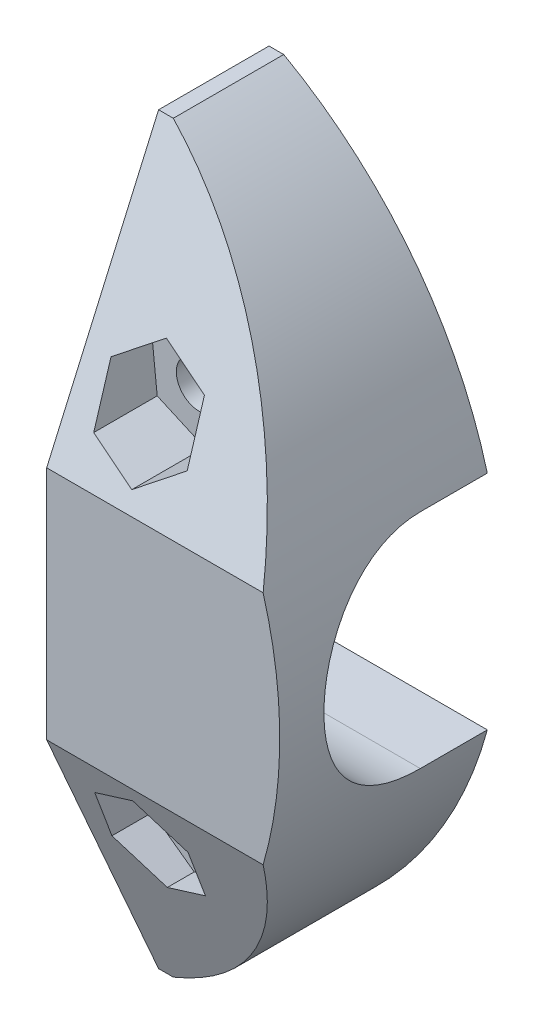
ISO-10303-21;
HEADER;
FILE_DESCRIPTION(('STEP AP214'),'2;1');
FILE_NAME('part.step','',(''),(''),'','','');
FILE_SCHEMA(('AUTOMOTIVE_DESIGN { 1 0 10303 214 1 1 1 1 }'));
ENDSEC;
DATA;
#1=APPLICATION_CONTEXT('core data for automotive mechanical design processes');
#2=APPLICATION_PROTOCOL_DEFINITION('international standard','automotive_design',2000,#1);
#3=PRODUCT_CONTEXT('',#1,'mechanical');
#4=PRODUCT('Part','Part','',(#3));
#5=PRODUCT_RELATED_PRODUCT_CATEGORY('part','',(#4));
#6=PRODUCT_DEFINITION_FORMATION('','',#4);
#7=PRODUCT_DEFINITION_CONTEXT('part definition',#1,'design');
#8=PRODUCT_DEFINITION('design','',#6,#7);
#9=PRODUCT_DEFINITION_SHAPE('','',#8);
#10=(LENGTH_UNIT() NAMED_UNIT(*) SI_UNIT(.MILLI.,.METRE.));
#11=(NAMED_UNIT(*) PLANE_ANGLE_UNIT() SI_UNIT($,.RADIAN.));
#12=(NAMED_UNIT(*) SI_UNIT($,.STERADIAN.) SOLID_ANGLE_UNIT());
#13=UNCERTAINTY_MEASURE_WITH_UNIT(LENGTH_MEASURE(1.E-05),#10,'distance_accuracy_value','');
#14=(GEOMETRIC_REPRESENTATION_CONTEXT(3) GLOBAL_UNCERTAINTY_ASSIGNED_CONTEXT((#13)) GLOBAL_UNIT_ASSIGNED_CONTEXT((#10,
#11,#12)) REPRESENTATION_CONTEXT('',''));
#15=CARTESIAN_POINT('',(0.,0.,0.));
#16=DIRECTION('',(0.,0.,1.));
#17=DIRECTION('',(1.,0.,0.));
#18=AXIS2_PLACEMENT_3D('',#15,#16,#17);
#19=CARTESIAN_POINT('',(598.976291153302,1616.33019387491,121.824310043391));
#20=DIRECTION('',(0.,0.,1.));
#21=DIRECTION('',(1.,0.,0.));
#22=AXIS2_PLACEMENT_3D('',#19,#20,#21);
#23=PLANE('',#22);
#24=CARTESIAN_POINT('',(602.193649020213,1619.83273752735,121.824310043391));
#25=DIRECTION('',(0.,0.,1.));
#26=DIRECTION('',(1.,0.,0.));
#27=AXIS2_PLACEMENT_3D('',#24,#25,#26);
#28=CIRCLE('',#27,1.54999999999994);
#29=CARTESIAN_POINT('',(603.743649020213,1619.83273752735,121.824310043391));
#30=VERTEX_POINT('',#29);
#31=EDGE_CURVE('E20',#30,#30,#28,.T.);
#32=ORIENTED_EDGE('',*,*,#31,.F.);
#33=EDGE_LOOP('',(#32));
#34=FACE_BOUND('',#33,.T.);
#35=DIRECTION('',(-0.809016994374525,-0.587785252293055,0.));
#36=VECTOR('',#35,1.);
#37=CARTESIAN_POINT('',(603.986394039705,1617.3652356945,121.824310043391));
#38=LINE('',#37,#36);
#39=CARTESIAN_POINT('',(605.411006887008,1618.40027751402,121.824310043391));
#40=VERTEX_POINT('',#39);
#41=CARTESIAN_POINT('',(602.561781192153,1616.33019387497,121.824310043391));
#42=VERTEX_POINT('',#41);
#43=EDGE_CURVE('E173',#40,#42,#38,.T.);
#44=ORIENTED_EDGE('',*,*,#43,.F.);
#45=DIRECTION('',(0.104528463267525,-0.994521895368287,0.));
#46=VECTOR('',#45,1.);
#47=CARTESIAN_POINT('',(605.226940801088,1620.15154934032,121.824310043391));
#48=LINE('',#47,#46);
#49=CARTESIAN_POINT('',(605.042874714788,1621.90282116665,121.824310043391));
#50=VERTEX_POINT('',#49);
#51=EDGE_CURVE('E170',#50,#40,#48,.T.);
#52=ORIENTED_EDGE('',*,*,#51,.F.);
#53=DIRECTION('',(0.913545457642818,-0.406736643075313,0.));
#54=VECTOR('',#53,1.);
#55=CARTESIAN_POINT('',(603.434195781596,1622.61905117316,121.824310043391));
#56=LINE('',#55,#54);
#57=CARTESIAN_POINT('',(601.825516848273,1623.33528117972,121.824310043391));
#58=VERTEX_POINT('',#57);
#59=EDGE_CURVE('E378',#58,#50,#56,.T.);
#60=ORIENTED_EDGE('',*,*,#59,.F.);
#61=DIRECTION('',(0.809016994375806,0.587785252291291,0.));
#62=VECTOR('',#61,1.);
#63=CARTESIAN_POINT('',(600.400904000721,1622.30023936019,121.824310043391));
#64=LINE('',#63,#62);
#65=CARTESIAN_POINT('',(598.976291153419,1621.26519754068,121.824310043391));
#66=VERTEX_POINT('',#65);
#67=EDGE_CURVE('E383',#66,#58,#64,.T.);
#68=ORIENTED_EDGE('',*,*,#67,.F.);
#69=DIRECTION('',(-0.104528463267267,0.994521895368314,0.));
#70=VECTOR('',#69,1.);
#71=CARTESIAN_POINT('',(599.160357239339,1619.51392571438,121.824310043391));
#72=LINE('',#71,#70);
#73=CARTESIAN_POINT('',(599.34442332536,1617.7626538883,121.824310043391));
#74=VERTEX_POINT('',#73);
#75=EDGE_CURVE('E386',#74,#66,#72,.T.);
#76=ORIENTED_EDGE('',*,*,#75,.F.);
#77=DIRECTION('',(-0.913545457642719,0.406736643075536,0.));
#78=VECTOR('',#77,1.);
#79=CARTESIAN_POINT('',(600.95310225883,1617.04642388154,121.824310043391));
#80=LINE('',#79,#78);
#81=EDGE_CURVE('E389',#42,#74,#80,.T.);
#82=ORIENTED_EDGE('',*,*,#81,.F.);
#83=EDGE_LOOP('',(#44,#52,#60,#68,#76,#82));
#84=FACE_BOUND('',#83,.T.);
#85=ADVANCED_FACE('F16',(#34,#84),#23,.T.);
#86=CARTESIAN_POINT('',(605.042874715052,1621.90282116653,121.824310043391));
#87=DIRECTION('',(-0.994521895368287,-0.104528463267525,0.));
#88=DIRECTION('',(0.104528463267525,-0.994521895368287,0.));
#89=AXIS2_PLACEMENT_3D('',#86,#87,#88);
#90=PLANE('',#89);
#91=ORIENTED_EDGE('',*,*,#51,.T.);
#92=DIRECTION('',(0.,0.,-1.));
#93=VECTOR('',#92,1.);
#94=CARTESIAN_POINT('',(605.411006887125,1618.4002775141,124.295449963961));
#95=LINE('',#94,#93);
#96=CARTESIAN_POINT('',(605.411006887125,1618.4002775141,125.85506712193));
#97=VERTEX_POINT('',#96);
#98=EDGE_CURVE('E167',#97,#40,#95,.T.);
#99=ORIENTED_EDGE('',*,*,#98,.F.);
#100=DIRECTION('',(0.0957497735269688,-0.910998241746222,0.401141102861359));
#101=VECTOR('',#100,1.);
#102=CARTESIAN_POINT('',(605.042874715052,1621.90282116653,124.312787280793));
#103=LINE('',#102,#101);
#104=CARTESIAN_POINT('',(605.042874715052,1621.90282116653,124.312787280793));
#105=VERTEX_POINT('',#104);
#106=EDGE_CURVE('E164',#105,#97,#103,.T.);
#107=ORIENTED_EDGE('',*,*,#106,.F.);
#108=DIRECTION('',(0.,0.,1.));
#109=VECTOR('',#108,1.);
#110=CARTESIAN_POINT('',(605.042874715052,1621.90282116653,123.068548662092));
#111=LINE('',#110,#109);
#112=EDGE_CURVE('E381',#50,#105,#111,.T.);
#113=ORIENTED_EDGE('',*,*,#112,.F.);
#114=EDGE_LOOP('',(#91,#99,#107,#113));
#115=FACE_BOUND('',#114,.T.);
#116=ADVANCED_FACE('F169',(#115),#90,.T.);
#117=CARTESIAN_POINT('',(605.411006887125,1618.4002775141,121.824310043391));
#118=DIRECTION('',(-0.587785252293055,0.809016994374525,0.));
#119=DIRECTION('',(-0.809016994374525,-0.587785252293054,0.));
#120=AXIS2_PLACEMENT_3D('',#117,#118,#119);
#121=PLANE('',#120);
#122=ORIENTED_EDGE('',*,*,#43,.T.);
#123=DIRECTION('',(0.,0.,-1.));
#124=VECTOR('',#123,1.);
#125=CARTESIAN_POINT('',(602.561781192285,1616.33019387491,124.295449963961));
#126=LINE('',#125,#124);
#127=CARTESIAN_POINT('',(602.561781192285,1616.33019387491,126.766589884529));
#128=VERTEX_POINT('',#127);
#129=EDGE_CURVE('E179',#128,#42,#126,.T.);
#130=ORIENTED_EDGE('',*,*,#129,.F.);
#131=DIRECTION('',(-0.783209396566297,-0.56903493493963,0.250563931858733));
#132=VECTOR('',#131,1.);
#133=CARTESIAN_POINT('',(605.411006887125,1618.4002775141,125.85506712193));
#134=LINE('',#133,#132);
#135=EDGE_CURVE('E176',#97,#128,#134,.T.);
#136=ORIENTED_EDGE('',*,*,#135,.F.);
#137=ORIENTED_EDGE('',*,*,#98,.T.);
#138=EDGE_LOOP('',(#122,#130,#136,#137));
#139=FACE_BOUND('',#138,.T.);
#140=ADVANCED_FACE('F177',(#139),#121,.T.);
#141=CARTESIAN_POINT('',(602.561781192285,1616.33019387491,121.824310043391));
#142=DIRECTION('',(0.406736643075536,0.913545457642719,0.));
#143=DIRECTION('',(-0.913545457642719,0.406736643075536,0.));
#144=AXIS2_PLACEMENT_3D('',#141,#142,#143);
#145=PLANE('',#144);
#146=ORIENTED_EDGE('',*,*,#81,.T.);
#147=DIRECTION('',(0.,0.,-1.));
#148=VECTOR('',#147,1.);
#149=CARTESIAN_POINT('',(599.344423325375,1617.76265388816,123.98007142469));
#150=LINE('',#149,#148);
#151=CARTESIAN_POINT('',(599.344423325375,1617.76265388816,126.135832805988));
#152=VERTEX_POINT('',#151);
#153=EDGE_CURVE('E388',#152,#74,#150,.T.);
#154=ORIENTED_EDGE('',*,*,#153,.F.);
#155=DIRECTION('',(-0.899237139169757,0.40036616925291,-0.176293783371792));
#156=VECTOR('',#155,1.);
#157=CARTESIAN_POINT('',(602.561781192285,1616.33019387491,126.766589884529));
#158=LINE('',#157,#156);
#159=EDGE_CURVE('E183',#128,#152,#158,.T.);
#160=ORIENTED_EDGE('',*,*,#159,.F.);
#161=ORIENTED_EDGE('',*,*,#129,.T.);
#162=EDGE_LOOP('',(#146,#154,#160,#161));
#163=FACE_BOUND('',#162,.T.);
#164=ADVANCED_FACE('F522',(#163),#145,.T.);
#165=CARTESIAN_POINT('',(599.344423325375,1617.76265388816,121.824310043391));
#166=DIRECTION('',(0.994521895368314,0.104528463267267,0.));
#167=DIRECTION('',(-0.104528463267267,0.994521895368314,0.));
#168=AXIS2_PLACEMENT_3D('',#165,#166,#167);
#169=PLANE('',#168);
#170=ORIENTED_EDGE('',*,*,#75,.T.);
#171=DIRECTION('',(3.60820899611147E-13,0.,-1.));
#172=VECTOR('',#171,1.);
#173=CARTESIAN_POINT('',(598.976291153301,1621.2651975406,123.20893150412));
#174=LINE('',#173,#172);
#175=CARTESIAN_POINT('',(598.976291153302,1621.2651975406,124.593552964847));
#176=VERTEX_POINT('',#175);
#177=EDGE_CURVE('E385',#176,#66,#174,.T.);
#178=ORIENTED_EDGE('',*,*,#177,.F.);
#179=DIRECTION('',(-0.095749773526775,0.91099824174624,-0.401141102861364));
#180=VECTOR('',#179,1.);
#181=CARTESIAN_POINT('',(599.344423325375,1617.76265388816,126.135832805988));
#182=LINE('',#181,#180);
#183=EDGE_CURVE('E195',#152,#176,#182,.T.);
#184=ORIENTED_EDGE('',*,*,#183,.F.);
#185=ORIENTED_EDGE('',*,*,#153,.T.);
#186=EDGE_LOOP('',(#170,#178,#184,#185));
#187=FACE_BOUND('',#186,.T.);
#188=ADVANCED_FACE('F526',(#187),#169,.T.);
#189=CARTESIAN_POINT('',(598.976291153302,1621.2651975406,121.824310043391));
#190=DIRECTION('',(0.587785252291291,-0.809016994375806,2.12085203509909E-13));
#191=DIRECTION('',(0.809016994375806,0.587785252291291,0.));
#192=AXIS2_PLACEMENT_3D('',#189,#190,#191);
#193=PLANE('',#192);
#194=ORIENTED_EDGE('',*,*,#67,.T.);
#195=DIRECTION('',(0.,0.,-1.));
#196=VECTOR('',#195,1.);
#197=CARTESIAN_POINT('',(601.825516848141,1623.33528117978,123.068548662092));
#198=LINE('',#197,#196);
#199=CARTESIAN_POINT('',(601.825516848141,1623.33528117978,123.682030202252));
#200=VERTEX_POINT('',#199);
#201=EDGE_CURVE('E382',#200,#58,#198,.T.);
#202=ORIENTED_EDGE('',*,*,#201,.F.);
#203=DIRECTION('',(0.783209396567426,0.56903493493833,-0.250563931858156));
#204=VECTOR('',#203,1.);
#205=CARTESIAN_POINT('',(598.976291153302,1621.2651975406,124.593552964848));
#206=LINE('',#205,#204);
#207=EDGE_CURVE('E198',#176,#200,#206,.T.);
#208=ORIENTED_EDGE('',*,*,#207,.F.);
#209=ORIENTED_EDGE('',*,*,#177,.T.);
#210=EDGE_LOOP('',(#194,#202,#208,#209));
#211=FACE_BOUND('',#210,.T.);
#212=ADVANCED_FACE('F528',(#211),#193,.T.);
#213=CARTESIAN_POINT('',(601.825516848141,1623.33528117978,121.824310043391));
#214=DIRECTION('',(-0.406736643075313,-0.913545457642818,0.));
#215=DIRECTION('',(0.913545457642818,-0.406736643075313,0.));
#216=AXIS2_PLACEMENT_3D('',#213,#214,#215);
#217=PLANE('',#216);
#218=ORIENTED_EDGE('',*,*,#59,.T.);
#219=ORIENTED_EDGE('',*,*,#112,.T.);
#220=DIRECTION('',(0.899237139169845,-0.400366169252749,0.176293783371714));
#221=VECTOR('',#220,1.);
#222=CARTESIAN_POINT('',(601.825516848141,1623.33528117978,123.682030202252));
#223=LINE('',#222,#221);
#224=EDGE_CURVE('E190',#200,#105,#223,.T.);
#225=ORIENTED_EDGE('',*,*,#224,.F.);
#226=ORIENTED_EDGE('',*,*,#201,.T.);
#227=EDGE_LOOP('',(#218,#219,#225,#226));
#228=FACE_BOUND('',#227,.T.);
#229=ADVANCED_FACE('F510',(#228),#217,.T.);
#230=CARTESIAN_POINT('',(602.193649020213,1619.83273752735,112.158060434751));
#231=DIRECTION('',(0.,0.,1.));
#232=DIRECTION('',(1.,0.,0.));
#233=AXIS2_PLACEMENT_3D('',#230,#231,#232);
#234=CYLINDRICAL_SURFACE('',#233,1.54999999999994);
#235=CARTESIAN_POINT('',(602.193649020213,1619.83273752735,112.158060434751));
#236=DIRECTION('',(0.,0.,1.));
#237=DIRECTION('',(1.,0.,0.));
#238=AXIS2_PLACEMENT_3D('',#235,#236,#237);
#239=CIRCLE('',#238,1.54999999999994);
#240=CARTESIAN_POINT('',(603.743649020213,1619.83273752735,112.158060434751));
#241=VERTEX_POINT('',#240);
#242=EDGE_CURVE('E202',#241,#241,#239,.T.);
#243=ORIENTED_EDGE('',*,*,#242,.F.);
#244=EDGE_LOOP('',(#243));
#245=FACE_BOUND('',#244,.T.);
#246=ORIENTED_EDGE('',*,*,#31,.T.);
#247=EDGE_LOOP('',(#246));
#248=FACE_BOUND('',#247,.T.);
#249=ADVANCED_FACE('F498',(#245,#248),#234,.F.);
#250=CARTESIAN_POINT('',(598.272304045856,1581.95432714919,112.158060434751));
#251=DIRECTION('',(0.,-1.,0.));
#252=DIRECTION('',(0.,0.,1.));
#253=AXIS2_PLACEMENT_3D('',#250,#251,#252);
#254=PLANE('',#253);
#255=DIRECTION('',(-1.,0.,0.));
#256=VECTOR('',#255,1.);
#257=CARTESIAN_POINT('',(597.772304045856,1581.95432714919,119.658060434751));
#258=LINE('',#257,#256);
#259=CARTESIAN_POINT('',(598.272304045858,1581.95432714919,119.65806043475));
#260=VERTEX_POINT('',#259);
#261=CARTESIAN_POINT('',(597.272304045855,1581.95432714919,119.658060434751));
#262=VERTEX_POINT('',#261);
#263=EDGE_CURVE('E191',#260,#262,#258,.T.);
#264=ORIENTED_EDGE('',*,*,#263,.T.);
#265=DIRECTION('',(0.,0.,1.));
#266=VECTOR('',#265,1.);
#267=CARTESIAN_POINT('',(597.272304045855,1581.95432714919,119.70806043475));
#268=LINE('',#267,#266);
#269=CARTESIAN_POINT('',(597.272304045855,1581.95432714919,112.15806043475));
#270=VERTEX_POINT('',#269);
#271=EDGE_CURVE('E352',#270,#262,#268,.T.);
#272=ORIENTED_EDGE('',*,*,#271,.F.);
#273=DIRECTION('',(-1.,0.,0.));
#274=VECTOR('',#273,1.);
#275=CARTESIAN_POINT('',(604.685303347223,1581.95432714919,112.158060434751));
#276=LINE('',#275,#274);
#277=CARTESIAN_POINT('',(598.272304045858,1581.95432714919,112.158060434751));
#278=VERTEX_POINT('',#277);
#279=EDGE_CURVE('E339',#278,#270,#276,.T.);
#280=ORIENTED_EDGE('',*,*,#279,.F.);
#281=DIRECTION('',(0.,0.,-1.));
#282=VECTOR('',#281,1.);
#283=CARTESIAN_POINT('',(598.272304045855,1581.95432714919,119.70806043475));
#284=LINE('',#283,#282);
#285=EDGE_CURVE('E321',#260,#278,#284,.T.);
#286=ORIENTED_EDGE('',*,*,#285,.F.);
#287=EDGE_LOOP('',(#264,#272,#280,#286));
#288=FACE_BOUND('',#287,.T.);
#289=ADVANCED_FACE('F485',(#288),#254,.T.);
#290=CARTESIAN_POINT('',(597.272304045856,1632.47378470606,119.65806043475));
#291=DIRECTION('',(0.,0.402992678747946,0.915203201958753));
#292=DIRECTION('',(0.,-0.915203201958753,0.402992678747946));
#293=AXIS2_PLACEMENT_3D('',#290,#291,#292);
#294=PLANE('',#293);
#295=ORIENTED_EDGE('',*,*,#207,.T.);
#296=ORIENTED_EDGE('',*,*,#224,.T.);
#297=ORIENTED_EDGE('',*,*,#106,.T.);
#298=ORIENTED_EDGE('',*,*,#135,.T.);
#299=ORIENTED_EDGE('',*,*,#159,.T.);
#300=ORIENTED_EDGE('',*,*,#183,.T.);
#301=EDGE_LOOP('',(#295,#296,#297,#298,#299,#300));
#302=FACE_BOUND('',#301,.T.);
#303=DIRECTION('',(0.,0.915203201958773,-0.402992678747902));
#304=VECTOR('',#303,1.);
#305=CARTESIAN_POINT('',(597.272304045855,1615.21405592762,127.25806043475));
#306=LINE('',#305,#304);
#307=CARTESIAN_POINT('',(597.272304045855,1615.21405592762,127.25806043475));
#308=VERTEX_POINT('',#307);
#309=CARTESIAN_POINT('',(597.272304045855,1632.47378470606,119.658060434751));
#310=VERTEX_POINT('',#309);
#311=EDGE_CURVE('E313',#308,#310,#306,.T.);
#312=ORIENTED_EDGE('',*,*,#311,.F.);
#313=DIRECTION('',(-1.,0.,0.));
#314=VECTOR('',#313,1.);
#315=CARTESIAN_POINT('',(605.773580294025,1615.21405592762,127.25806043475));
#316=LINE('',#315,#314);
#317=CARTESIAN_POINT('',(611.972733861954,1615.21405592762,127.25806043475));
#318=VERTEX_POINT('',#317);
#319=EDGE_CURVE('E320',#318,#308,#316,.T.);
#320=ORIENTED_EDGE('',*,*,#319,.F.);
#321=CARTESIAN_POINT('',(584.172304045849,1607.21405592762,130.780711386018));
#322=DIRECTION('',(0.,0.402992678747946,0.915203201958753));
#323=DIRECTION('',(0.,0.915203201958753,-0.402992678747946));
#324=AXIS2_PLACEMENT_3D('',#321,#322,#323);
#325=ELLIPSE('',#324,31.6089366143924,28.9286000000032);
#326=CARTESIAN_POINT('',(598.27230404585,1632.47378470606,119.65806043475));
#327=VERTEX_POINT('',#326);
#328=EDGE_CURVE('E322',#327,#318,#325,.F.);
#329=ORIENTED_EDGE('',*,*,#328,.F.);
#330=DIRECTION('',(1.,0.,0.));
#331=VECTOR('',#330,1.);
#332=CARTESIAN_POINT('',(597.772304045856,1632.47378470606,119.658060434751));
#333=LINE('',#332,#331);
#334=EDGE_CURVE('E201',#310,#327,#333,.T.);
#335=ORIENTED_EDGE('',*,*,#334,.F.);
#336=EDGE_LOOP('',(#312,#320,#329,#335));
#337=FACE_BOUND('',#336,.T.);
#338=ADVANCED_FACE('F187',(#302,#337),#294,.T.);
#339=CARTESIAN_POINT('',(598.272304045856,1632.47378470606,119.658060434751));
#340=DIRECTION('',(0.,1.,0.));
#341=DIRECTION('',(0.,0.,-1.));
#342=AXIS2_PLACEMENT_3D('',#339,#340,#341);
#343=PLANE('',#342);
#344=ORIENTED_EDGE('',*,*,#334,.T.);
#345=DIRECTION('',(0.,0.,1.));
#346=VECTOR('',#345,1.);
#347=CARTESIAN_POINT('',(598.272304045855,1632.47378470606,119.70806043475));
#348=LINE('',#347,#346);
#349=CARTESIAN_POINT('',(598.272304045849,1632.47378470606,112.158060434751));
#350=VERTEX_POINT('',#349);
#351=EDGE_CURVE('E323',#350,#327,#348,.T.);
#352=ORIENTED_EDGE('',*,*,#351,.F.);
#353=DIRECTION('',(1.,0.,0.));
#354=VECTOR('',#353,1.);
#355=CARTESIAN_POINT('',(604.685303347223,1632.47378470606,112.158060434751));
#356=LINE('',#355,#354);
#357=CARTESIAN_POINT('',(597.272304045855,1632.47378470606,112.15806043475));
#358=VERTEX_POINT('',#357);
#359=EDGE_CURVE('E206',#358,#350,#356,.T.);
#360=ORIENTED_EDGE('',*,*,#359,.F.);
#361=DIRECTION('',(0.,0.,-1.));
#362=VECTOR('',#361,1.);
#363=CARTESIAN_POINT('',(597.272304045855,1632.47378470606,119.70806043475));
#364=LINE('',#363,#362);
#365=EDGE_CURVE('E316',#310,#358,#364,.T.);
#366=ORIENTED_EDGE('',*,*,#365,.F.);
#367=EDGE_LOOP('',(#344,#352,#360,#366));
#368=FACE_BOUND('',#367,.T.);
#369=ADVANCED_FACE('F490',(#368),#343,.T.);
#370=CARTESIAN_POINT('',(612.098302648591,1614.76405592762,112.158060434751));
#371=DIRECTION('',(0.,0.,-1.));
#372=DIRECTION('',(-1.,0.,0.));
#373=AXIS2_PLACEMENT_3D('',#370,#371,#372);
#374=PLANE('',#373);
#375=ORIENTED_EDGE('',*,*,#242,.T.);
#376=EDGE_LOOP('',(#375));
#377=FACE_BOUND('',#376,.T.);
#378=CARTESIAN_POINT('',(584.172304045849,1607.21405592762,112.158060434751));
#379=DIRECTION('',(0.,0.,-1.));
#380=DIRECTION('',(-1.,0.,0.));
#381=AXIS2_PLACEMENT_3D('',#378,#379,#380);
#382=CIRCLE('',#381,28.9286000000032);
#383=CARTESIAN_POINT('',(612.09830264859,1614.76405592762,112.15806043475));
#384=VERTEX_POINT('',#383);
#385=EDGE_CURVE('E221',#384,#350,#382,.F.);
#386=ORIENTED_EDGE('',*,*,#385,.F.);
#387=DIRECTION('',(1.,0.,0.));
#388=VECTOR('',#387,1.);
#389=CARTESIAN_POINT('',(604.685303347223,1614.76405592762,112.15806043475));
#390=LINE('',#389,#388);
#391=CARTESIAN_POINT('',(597.272304045855,1614.76405592763,112.15806043475));
#392=VERTEX_POINT('',#391);
#393=EDGE_CURVE('E205',#392,#384,#390,.T.);
#394=ORIENTED_EDGE('',*,*,#393,.F.);
#395=DIRECTION('',(0.,-1.,0.));
#396=VECTOR('',#395,1.);
#397=CARTESIAN_POINT('',(597.272304045855,1607.21405592763,112.15806043475));
#398=LINE('',#397,#396);
#399=EDGE_CURVE('E359',#358,#392,#398,.T.);
#400=ORIENTED_EDGE('',*,*,#399,.F.);
#401=ORIENTED_EDGE('',*,*,#359,.T.);
#402=EDGE_LOOP('',(#386,#394,#400,#401));
#403=FACE_BOUND('',#402,.T.);
#404=ADVANCED_FACE('F487',(#377,#403),#374,.T.);
#405=CARTESIAN_POINT('',(597.272304045855,1614.76405592762,116.70806043475));
#406=DIRECTION('',(0.,-1.,0.));
#407=DIRECTION('',(0.,0.,-1.));
#408=AXIS2_PLACEMENT_3D('',#405,#406,#407);
#409=PLANE('',#408);
#410=DIRECTION('',(1.,0.,0.));
#411=VECTOR('',#410,1.);
#412=CARTESIAN_POINT('',(605.265747045855,1614.76405592763,116.708060434749));
#413=LINE('',#412,#411);
#414=CARTESIAN_POINT('',(597.272304045855,1614.76405592763,116.708060434749));
#415=VERTEX_POINT('',#414);
#416=CARTESIAN_POINT('',(612.098302648588,1614.76405592762,116.708060434749));
#417=VERTEX_POINT('',#416);
#418=EDGE_CURVE('E348',#415,#417,#413,.T.);
#419=ORIENTED_EDGE('',*,*,#418,.F.);
#420=DIRECTION('',(0.,0.,1.));
#421=VECTOR('',#420,1.);
#422=CARTESIAN_POINT('',(597.272304045855,1614.76405592763,119.70806043475));
#423=LINE('',#422,#421);
#424=EDGE_CURVE('E312',#392,#415,#423,.T.);
#425=ORIENTED_EDGE('',*,*,#424,.F.);
#426=ORIENTED_EDGE('',*,*,#393,.T.);
#427=DIRECTION('',(0.,0.,-1.));
#428=VECTOR('',#427,1.);
#429=CARTESIAN_POINT('',(612.098302648591,1614.76405592762,119.70806043475));
#430=LINE('',#429,#428);
#431=EDGE_CURVE('E220',#417,#384,#430,.T.);
#432=ORIENTED_EDGE('',*,*,#431,.F.);
#433=EDGE_LOOP('',(#419,#425,#426,#432));
#434=FACE_BOUND('',#433,.T.);
#435=ADVANCED_FACE('F233',(#434),#409,.T.);
#436=CARTESIAN_POINT('',(597.272304045855,1607.21405592763,116.708060434749));
#437=DIRECTION('',(1.,0.,0.));
#438=DIRECTION('',(0.,0.,-1.));
#439=AXIS2_PLACEMENT_3D('',#436,#437,#438);
#440=CYLINDRICAL_SURFACE('',#439,7.55000000000365);
#441=CARTESIAN_POINT('',(612.098302648589,1599.66405592763,116.70806043475));
#442=CARTESIAN_POINT('',(612.098277358506,1599.66402845705,116.915926219152));
#443=CARTESIAN_POINT('',(612.100622575665,1599.67263888254,117.123787267952));
#444=CARTESIAN_POINT('',(612.109874039592,1599.70694840851,117.538089735537));
#445=CARTESIAN_POINT('',(612.116782380385,1599.73265535463,117.744530458565));
#446=CARTESIAN_POINT('',(612.13490469055,1599.80068851997,118.152696840834));
#447=CARTESIAN_POINT('',(612.146082648187,1599.84287580299,118.354447354429));
#448=CARTESIAN_POINT('',(612.17240343914,1599.94349524112,118.753478773277));
#449=CARTESIAN_POINT('',(612.187543706031,1600.00191688258,118.950762482182));
#450=CARTESIAN_POINT('',(612.211976970619,1600.09776758878,119.231814222192));
#451=CARTESIAN_POINT('',(612.21986079119,1600.12888890392,119.317903352512));
#452=CARTESIAN_POINT('',(612.236288919148,1600.19424195056,119.488904947449));
#453=CARTESIAN_POINT('',(612.244833728856,1600.22847605117,119.573816458182));
#454=CARTESIAN_POINT('',(612.27432351865,1600.34763078103,119.854525146262));
#455=CARTESIAN_POINT('',(612.296624164789,1600.43932317235,120.047359370745));
#456=CARTESIAN_POINT('',(612.343878303903,1600.63858763077,120.424406891419));
#457=CARTESIAN_POINT('',(612.36883338469,1600.74616921748,120.608614931702));
#458=CARTESIAN_POINT('',(612.420701749472,1600.97659718647,120.967419974597));
#459=CARTESIAN_POINT('',(612.44761851994,1601.09947103578,121.14199884629));
#460=CARTESIAN_POINT('',(612.502601959153,1601.35950392119,121.480085412248));
#461=CARTESIAN_POINT('',(612.530669080245,1601.49666861015,121.643588682944));
#462=CARTESIAN_POINT('',(612.58709681044,1601.78406034795,121.958103092505));
#463=CARTESIAN_POINT('',(612.615456835018,1601.93426463863,122.109135132849));
#464=CARTESIAN_POINT('',(612.671735745048,1602.24701045464,122.398078396202));
#465=CARTESIAN_POINT('',(612.699654423538,1602.40955757206,122.535983607399));
#466=CARTESIAN_POINT('',(612.754244267736,1602.74577049967,122.797581657537));
#467=CARTESIAN_POINT('',(612.780916084587,1602.91943039168,122.921281964918));
#468=CARTESIAN_POINT('',(612.832272422005,1603.27671395166,123.153618896898));
#469=CARTESIAN_POINT('',(612.856957871681,1603.4603328933,123.262262581503));
#470=CARTESIAN_POINT('',(612.90373753831,1603.8369648982,123.464060811826));
#471=CARTESIAN_POINT('',(612.92582339027,1604.03000560398,123.557165738016));
#472=CARTESIAN_POINT('',(612.96667800143,1604.42352939736,123.726703017303));
#473=CARTESIAN_POINT('',(612.985448020396,1604.62400962332,123.803141704904));
#474=CARTESIAN_POINT('',(613.019144101934,1605.03107033376,123.938765931862));
#475=CARTESIAN_POINT('',(613.034069667409,1605.23765160326,123.997949240185));
#476=CARTESIAN_POINT('',(613.059639216887,1605.65535777997,124.098534380712));
#477=CARTESIAN_POINT('',(613.070283315188,1605.86648256572,124.139936687597));
#478=CARTESIAN_POINT('',(613.086750180003,1606.28586692925,124.203707084196));
#479=CARTESIAN_POINT('',(613.092696593256,1606.49404746517,124.22656378248));
#480=CARTESIAN_POINT('',(613.100077361805,1606.91166618697,124.254904806687));
#481=CARTESIAN_POINT('',(613.101511799985,1607.12110434968,124.260389451725));
#482=CARTESIAN_POINT('',(613.099828484694,1607.53966990222,124.253938867988));
#483=CARTESIAN_POINT('',(613.096711231989,1607.74879732371,124.242005555494));
#484=CARTESIAN_POINT('',(613.086012881588,1608.16522397708,124.200827300327));
#485=CARTESIAN_POINT('',(613.078431809377,1608.37252321941,124.171582456491));
#486=CARTESIAN_POINT('',(613.059190106249,1608.78013595004,124.096705109286));
#487=CARTESIAN_POINT('',(613.047604170729,1608.98050813219,124.051372278945));
#488=CARTESIAN_POINT('',(613.02063525064,1609.37672295812,123.944598454045));
#489=CARTESIAN_POINT('',(613.005250982984,1609.57256404679,123.883152015836));
#490=CARTESIAN_POINT('',(612.971099128158,1609.95828272855,123.744657575934));
#491=CARTESIAN_POINT('',(612.952332436858,1610.14816188512,123.667613704726));
#492=CARTESIAN_POINT('',(612.91189659356,1610.52084725467,123.498459931646));
#493=CARTESIAN_POINT('',(612.890226355794,1610.70365078863,123.406344390929));
#494=CARTESIAN_POINT('',(612.844148557932,1611.0640977104,123.205978463245));
#495=CARTESIAN_POINT('',(612.819699603494,1611.24159406482,123.097473093403));
#496=CARTESIAN_POINT('',(612.769024614292,1611.58692020895,122.866286566472));
#497=CARTESIAN_POINT('',(612.742797958172,1611.75474658041,122.743600442122));
#498=CARTESIAN_POINT('',(612.689273478276,1612.07959303991,122.484924045297));
#499=CARTESIAN_POINT('',(612.661975788257,1612.23661447062,122.348935430951));
#500=CARTESIAN_POINT('',(612.607029557695,1612.53889266479,122.064521975931));
#501=CARTESIAN_POINT('',(612.579381015142,1612.68414936082,121.916097063965));
#502=CARTESIAN_POINT('',(612.524337581839,1612.96265078704,121.607003274893));
#503=CARTESIAN_POINT('',(612.496944562265,1613.0958340843,121.4462787007));
#504=CARTESIAN_POINT('',(612.443303998402,1613.3484781583,121.114290115879));
#505=CARTESIAN_POINT('',(612.417056067496,1613.46794358919,120.943029710281));
#506=CARTESIAN_POINT('',(612.366405807064,1613.69246482027,120.590887933815));
#507=CARTESIAN_POINT('',(612.342004696042,1613.79751114349,120.410000342819));
#508=CARTESIAN_POINT('',(612.295766712134,1613.99231301469,120.039941987474));
#509=CARTESIAN_POINT('',(612.273928857112,1614.0820744252,119.850774434065));
#510=CARTESIAN_POINT('',(612.233732436771,1614.24449231605,119.468139076389));
#511=CARTESIAN_POINT('',(612.215328038446,1614.31737781669,119.274773311313));
#512=CARTESIAN_POINT('',(612.182149606062,1614.44710061935,118.882507044228));
#513=CARTESIAN_POINT('',(612.167374134194,1614.50394427863,118.683608769132));
#514=CARTESIAN_POINT('',(612.141897814764,1614.60108793426,118.281879493624));
#515=CARTESIAN_POINT('',(612.131190875626,1614.64141267057,118.079054854306));
#516=CARTESIAN_POINT('',(612.114145023739,1614.70528565966,117.670685012273));
#517=CARTESIAN_POINT('',(612.107803627438,1614.7288434514,117.465141424317));
#518=CARTESIAN_POINT('',(612.101927212996,1614.75063899209,117.16727910018));
#519=CARTESIAN_POINT('',(612.100567994017,1614.75567286743,117.075448129954));
#520=CARTESIAN_POINT('',(612.098756089008,1614.76237912824,116.891768539249));
#521=CARTESIAN_POINT('',(612.098302281959,1614.76405567054,116.799920081587));
#522=CARTESIAN_POINT('',(612.098302648585,1614.76405592763,116.70806043475));
#523=B_SPLINE_CURVE_WITH_KNOTS('',3,(#441,#442,#443,#444,#445,#446,#447,#448,#449,#450,#451,
#452,#453,#454,#455,#456,#457,#458,#459,#460,#461,#462,#463,#464,#465,#466,#467,#468,#469,#470,
#471,#472,#473,#474,#475,#476,#477,#478,#479,#480,#481,#482,#483,#484,#485,#486,#487,#488,#489,
#490,#491,#492,#493,#494,#495,#496,#497,#498,#499,#500,#501,#502,#503,#504,#505,#506,#507,#508,
#509,#510,#511,#512,#513,#514,#515,#516,#517,#518,#519,#520,#521,#522),.UNSPECIFIED.,.F.,.F.,(4,
2,2,2,2,2,2,2,2,2,2,2,2,2,2,2,2,2,2,2,2,2,2,2,2,2,2,2,2,2,2,2,2,2,2,2,2,2,2,2,4),(0.,
0.623400596595874,1.24708747164623,1.86562609353718,2.4837650691855,2.75935472444055,
3.03515591187803,3.67834967991438,4.32193037653956,4.96668418399369,5.61169400454,
6.25559988348246,6.8997992530267,7.54365835922184,8.18721453289685,8.83278798869724,
9.47811564550139,10.1235267029159,10.7689205294146,11.3967016004026,12.0244711392672,
12.652171617649,13.2798685123183,13.8964389843188,14.5132180208619,15.129833936191,
15.7466810790845,16.3743628855863,17.0022652277422,17.6300894025431,18.2579171765746,
18.88877859731,19.5194253449626,20.1504846206555,20.7813013051318,21.4029767517752,
22.0244054866681,22.6449000915574,23.2650414055715,23.5409233978038,23.8164635993306),.UNSPECIFIED.);
#524=CARTESIAN_POINT('',(612.098302648589,1599.66405592762,116.70806043475));
#525=VERTEX_POINT('',#524);
#526=EDGE_CURVE('E212',#525,#417,#523,.T.);
#527=ORIENTED_EDGE('',*,*,#526,.F.);
#528=DIRECTION('',(1.,0.,0.));
#529=VECTOR('',#528,1.);
#530=CARTESIAN_POINT('',(604.685303347223,1599.66405592762,116.70806043475));
#531=LINE('',#530,#529);
#532=CARTESIAN_POINT('',(597.272304045855,1599.66405592762,116.708060434749));
#533=VERTEX_POINT('',#532);
#534=EDGE_CURVE('E343',#533,#525,#531,.T.);
#535=ORIENTED_EDGE('',*,*,#534,.F.);
#536=CARTESIAN_POINT('',(597.272304045855,1607.21405592763,116.708060434749));
#537=DIRECTION('',(1.,0.,0.));
#538=DIRECTION('',(0.,0.,-1.));
#539=AXIS2_PLACEMENT_3D('',#536,#537,#538);
#540=CIRCLE('',#539,7.55000000000365);
#541=EDGE_CURVE('E308',#415,#533,#540,.T.);
#542=ORIENTED_EDGE('',*,*,#541,.F.);
#543=ORIENTED_EDGE('',*,*,#418,.T.);
#544=EDGE_LOOP('',(#527,#535,#542,#543));
#545=FACE_BOUND('',#544,.T.);
#546=ADVANCED_FACE('F227',(#545),#440,.F.);
#547=CARTESIAN_POINT('',(597.272304045855,1599.66405592762,112.158060434751));
#548=DIRECTION('',(0.,1.,0.));
#549=DIRECTION('',(0.,0.,1.));
#550=AXIS2_PLACEMENT_3D('',#547,#548,#549);
#551=PLANE('',#550);
#552=ORIENTED_EDGE('',*,*,#534,.T.);
#553=DIRECTION('',(0.,0.,1.));
#554=VECTOR('',#553,1.);
#555=CARTESIAN_POINT('',(612.09830264859,1599.66405592762,119.70806043475));
#556=LINE('',#555,#554);
#557=CARTESIAN_POINT('',(612.098302648589,1599.66405592762,112.158060434751));
#558=VERTEX_POINT('',#557);
#559=EDGE_CURVE('E210',#558,#525,#556,.T.);
#560=ORIENTED_EDGE('',*,*,#559,.F.);
#561=DIRECTION('',(1.,0.,0.));
#562=VECTOR('',#561,1.);
#563=CARTESIAN_POINT('',(604.685303347223,1599.66405592762,112.158060434751));
#564=LINE('',#563,#562);
#565=CARTESIAN_POINT('',(597.272304045855,1599.66405592762,112.15806043475));
#566=VERTEX_POINT('',#565);
#567=EDGE_CURVE('E211',#566,#558,#564,.T.);
#568=ORIENTED_EDGE('',*,*,#567,.F.);
#569=DIRECTION('',(0.,0.,-1.));
#570=VECTOR('',#569,1.);
#571=CARTESIAN_POINT('',(597.272304045855,1599.66405592762,119.70806043475));
#572=LINE('',#571,#570);
#573=EDGE_CURVE('E311',#533,#566,#572,.T.);
#574=ORIENTED_EDGE('',*,*,#573,.F.);
#575=EDGE_LOOP('',(#552,#560,#568,#574));
#576=FACE_BOUND('',#575,.T.);
#577=ADVANCED_FACE('F232',(#576),#551,.T.);
#578=CARTESIAN_POINT('',(612.098302648591,1581.95432714919,112.158060434751));
#579=DIRECTION('',(0.,0.,-1.));
#580=DIRECTION('',(-1.,0.,0.));
#581=AXIS2_PLACEMENT_3D('',#578,#579,#580);
#582=PLANE('',#581);
#583=CARTESIAN_POINT('',(602.193649020213,1594.5953743279,112.158060434751));
#584=DIRECTION('',(0.,0.,1.));
#585=DIRECTION('',(1.,0.,0.));
#586=AXIS2_PLACEMENT_3D('',#583,#584,#585);
#587=CIRCLE('',#586,1.54999999999999);
#588=CARTESIAN_POINT('',(603.743649020213,1594.5953743279,112.158060434751));
#589=VERTEX_POINT('',#588);
#590=EDGE_CURVE('E304',#589,#589,#587,.F.);
#591=ORIENTED_EDGE('',*,*,#590,.F.);
#592=EDGE_LOOP('',(#591));
#593=FACE_BOUND('',#592,.T.);
#594=ORIENTED_EDGE('',*,*,#567,.T.);
#595=CARTESIAN_POINT('',(584.172304045849,1607.21405592762,112.158060434751));
#596=DIRECTION('',(0.,0.,-1.));
#597=DIRECTION('',(-1.,0.,0.));
#598=AXIS2_PLACEMENT_3D('',#595,#596,#597);
#599=CIRCLE('',#598,28.9286000000032);
#600=EDGE_CURVE('E207',#278,#558,#599,.F.);
#601=ORIENTED_EDGE('',*,*,#600,.F.);
#602=ORIENTED_EDGE('',*,*,#279,.T.);
#603=DIRECTION('',(0.,-1.,0.));
#604=VECTOR('',#603,1.);
#605=CARTESIAN_POINT('',(597.272304045855,1607.21405592763,112.15806043475));
#606=LINE('',#605,#604);
#607=EDGE_CURVE('E349',#566,#270,#606,.T.);
#608=ORIENTED_EDGE('',*,*,#607,.F.);
#609=EDGE_LOOP('',(#594,#601,#602,#608));
#610=FACE_BOUND('',#609,.T.);
#611=ADVANCED_FACE('F237',(#593,#610),#582,.T.);
#612=CARTESIAN_POINT('',(584.172304045849,1607.21405592762,127.25806043475));
#613=DIRECTION('',(0.,0.,-1.));
#614=DIRECTION('',(-1.,0.,0.));
#615=AXIS2_PLACEMENT_3D('',#612,#613,#614);
#616=CYLINDRICAL_SURFACE('',#615,28.9286000000032);
#617=CARTESIAN_POINT('',(584.172304045849,1607.21405592762,130.78071138602));
#618=DIRECTION('',(0.,-0.402992678748137,0.915203201958669));
#619=DIRECTION('',(0.,-0.915203201958669,-0.402992678748137));
#620=AXIS2_PLACEMENT_3D('',#617,#618,#619);
#621=ELLIPSE('',#620,31.6089366143953,28.9286000000032);
#622=CARTESIAN_POINT('',(611.972733861954,1599.21405592762,127.25806043475));
#623=VERTEX_POINT('',#622);
#624=EDGE_CURVE('E299',#260,#623,#621,.T.);
#625=ORIENTED_EDGE('',*,*,#624,.F.);
#626=ORIENTED_EDGE('',*,*,#285,.T.);
#627=ORIENTED_EDGE('',*,*,#600,.T.);
#628=ORIENTED_EDGE('',*,*,#559,.T.);
#629=ORIENTED_EDGE('',*,*,#526,.T.);
#630=ORIENTED_EDGE('',*,*,#431,.T.);
#631=ORIENTED_EDGE('',*,*,#385,.T.);
#632=ORIENTED_EDGE('',*,*,#351,.T.);
#633=ORIENTED_EDGE('',*,*,#328,.T.);
#634=CARTESIAN_POINT('',(584.172304045849,1607.21405592762,127.25806043475));
#635=DIRECTION('',(0.,0.,-1.));
#636=DIRECTION('',(-1.,0.,0.));
#637=AXIS2_PLACEMENT_3D('',#634,#635,#636);
#638=CIRCLE('',#637,28.9286000000032);
#639=EDGE_CURVE('E318',#623,#318,#638,.F.);
#640=ORIENTED_EDGE('',*,*,#639,.F.);
#641=EDGE_LOOP('',(#625,#626,#627,#628,#629,#630,#631,#632,#633,#640));
#642=FACE_BOUND('',#641,.T.);
#643=ADVANCED_FACE('F223',(#642),#616,.T.);
#644=CARTESIAN_POINT('',(597.272304045855,1615.21405592762,127.25806043475));
#645=DIRECTION('',(0.,0.,1.));
#646=DIRECTION('',(0.,-1.,0.));
#647=AXIS2_PLACEMENT_3D('',#644,#645,#646);
#648=PLANE('',#647);
#649=DIRECTION('',(0.,1.,0.));
#650=VECTOR('',#649,1.);
#651=CARTESIAN_POINT('',(597.272304045855,1607.21405592763,127.25806043475));
#652=LINE('',#651,#650);
#653=CARTESIAN_POINT('',(597.272304045855,1599.21405592762,127.25806043475));
#654=VERTEX_POINT('',#653);
#655=EDGE_CURVE('E317',#654,#308,#652,.T.);
#656=ORIENTED_EDGE('',*,*,#655,.F.);
#657=DIRECTION('',(-1.,0.,0.));
#658=VECTOR('',#657,1.);
#659=CARTESIAN_POINT('',(604.622518953906,1599.21405592762,127.25806043475));
#660=LINE('',#659,#658);
#661=EDGE_CURVE('E302',#623,#654,#660,.T.);
#662=ORIENTED_EDGE('',*,*,#661,.F.);
#663=ORIENTED_EDGE('',*,*,#639,.T.);
#664=ORIENTED_EDGE('',*,*,#319,.T.);
#665=EDGE_LOOP('',(#656,#662,#663,#664));
#666=FACE_BOUND('',#665,.T.);
#667=ADVANCED_FACE('F245',(#666),#648,.T.);
#668=CARTESIAN_POINT('',(597.272304045855,1581.95432714919,112.15806043475));
#669=DIRECTION('',(-1.,0.,0.));
#670=DIRECTION('',(0.,0.,1.));
#671=AXIS2_PLACEMENT_3D('',#668,#669,#670);
#672=PLANE('',#671);
#673=ORIENTED_EDGE('',*,*,#541,.T.);
#674=ORIENTED_EDGE('',*,*,#573,.T.);
#675=ORIENTED_EDGE('',*,*,#607,.T.);
#676=ORIENTED_EDGE('',*,*,#271,.T.);
#677=DIRECTION('',(0.,-0.915203201958669,-0.402992678748137));
#678=VECTOR('',#677,1.);
#679=CARTESIAN_POINT('',(597.272304045855,1590.58419153841,123.45806043475));
#680=LINE('',#679,#678);
#681=EDGE_CURVE('E298',#654,#262,#680,.T.);
#682=ORIENTED_EDGE('',*,*,#681,.F.);
#683=ORIENTED_EDGE('',*,*,#655,.T.);
#684=ORIENTED_EDGE('',*,*,#311,.T.);
#685=ORIENTED_EDGE('',*,*,#365,.T.);
#686=ORIENTED_EDGE('',*,*,#399,.T.);
#687=ORIENTED_EDGE('',*,*,#424,.T.);
#688=EDGE_LOOP('',(#673,#674,#675,#676,#682,#683,#684,#685,#686,#687));
#689=FACE_BOUND('',#688,.T.);
#690=ADVANCED_FACE('F440',(#689),#672,.T.);
#691=CARTESIAN_POINT('',(599.008576281589,1593.09040072927,121.824310043391));
#692=DIRECTION('',(0.994521895368257,-0.104528463267812,0.));
#693=DIRECTION('',(0.104528463267812,0.994521895368257,0.));
#694=AXIS2_PLACEMENT_3D('',#691,#692,#693);
#695=PLANE('',#694);
#696=DIRECTION('',(-0.104528463267818,-0.994521895368256,0.));
#697=VECTOR('',#696,1.);
#698=CARTESIAN_POINT('',(599.376708453663,1596.5929443817,121.824310043391));
#699=LINE('',#698,#697);
#700=CARTESIAN_POINT('',(599.376708453663,1596.5929443817,121.824310043391));
#701=VERTEX_POINT('',#700);
#702=CARTESIAN_POINT('',(599.008576281589,1593.09040072927,121.824310043391));
#703=VERTEX_POINT('',#702);
#704=EDGE_CURVE('E279',#701,#703,#699,.T.);
#705=ORIENTED_EDGE('',*,*,#704,.F.);
#706=DIRECTION('',(0.,0.,-1.));
#707=VECTOR('',#706,1.);
#708=CARTESIAN_POINT('',(599.376708453663,1596.5929443817,124.279484960803));
#709=LINE('',#708,#707);
#710=CARTESIAN_POINT('',(599.376708453663,1596.5929443817,126.103902799672));
#711=VERTEX_POINT('',#710);
#712=EDGE_CURVE('E286',#711,#701,#709,.T.);
#713=ORIENTED_EDGE('',*,*,#712,.F.);
#714=DIRECTION('',(0.0957497735272582,0.910998241746112,0.401141102861538));
#715=VECTOR('',#714,1.);
#716=CARTESIAN_POINT('',(599.008576281589,1593.09040072927,124.561622958535));
#717=LINE('',#716,#715);
#718=CARTESIAN_POINT('',(599.008576281589,1593.09040072927,124.561622958535));
#719=VERTEX_POINT('',#718);
#720=EDGE_CURVE('E293',#719,#711,#717,.T.);
#721=ORIENTED_EDGE('',*,*,#720,.F.);
#722=DIRECTION('',(0.,0.,1.));
#723=VECTOR('',#722,1.);
#724=CARTESIAN_POINT('',(599.008576281589,1593.09040072927,123.192966500962));
#725=LINE('',#724,#723);
#726=EDGE_CURVE('E307',#703,#719,#725,.T.);
#727=ORIENTED_EDGE('',*,*,#726,.F.);
#728=EDGE_LOOP('',(#705,#713,#721,#727));
#729=FACE_BOUND('',#728,.T.);
#730=ADVANCED_FACE('F412',(#729),#695,.T.);
#731=CARTESIAN_POINT('',(601.857801976429,1591.02031709008,121.824310043391));
#732=DIRECTION('',(0.587785252293028,0.809016994374544,0.));
#733=DIRECTION('',(-0.809016994374544,0.587785252293028,0.));
#734=AXIS2_PLACEMENT_3D('',#731,#732,#733);
#735=PLANE('',#734);
#736=DIRECTION('',(0.809016994374525,-0.587785252293055,0.));
#737=VECTOR('',#736,1.);
#738=CARTESIAN_POINT('',(599.008576281589,1593.09040072927,121.824310043391));
#739=LINE('',#738,#737);
#740=CARTESIAN_POINT('',(601.857801976429,1591.02031709008,121.824310043391));
#741=VERTEX_POINT('',#740);
#742=EDGE_CURVE('E276',#703,#741,#739,.T.);
#743=ORIENTED_EDGE('',*,*,#742,.F.);
#744=ORIENTED_EDGE('',*,*,#726,.T.);
#745=DIRECTION('',(-0.783209396566335,0.569034934939535,0.250563931858829));
#746=VECTOR('',#745,1.);
#747=CARTESIAN_POINT('',(601.857801976429,1591.02031709008,123.650100195935));
#748=LINE('',#747,#746);
#749=CARTESIAN_POINT('',(601.857801976429,1591.02031709008,123.650100195935));
#750=VERTEX_POINT('',#749);
#751=EDGE_CURVE('E295',#750,#719,#748,.T.);
#752=ORIENTED_EDGE('',*,*,#751,.F.);
#753=DIRECTION('',(0.,0.,1.));
#754=VECTOR('',#753,1.);
#755=CARTESIAN_POINT('',(601.857801976429,1591.02031709008,123.052583658933));
#756=LINE('',#755,#754);
#757=EDGE_CURVE('E303',#741,#750,#756,.T.);
#758=ORIENTED_EDGE('',*,*,#757,.F.);
#759=EDGE_LOOP('',(#743,#744,#752,#758));
#760=FACE_BOUND('',#759,.T.);
#761=ADVANCED_FACE('F433',(#760),#735,.T.);
#762=CARTESIAN_POINT('',(602.193649020213,1594.5953743279,112.158060434751));
#763=DIRECTION('',(0.,0.,1.));
#764=DIRECTION('',(1.,0.,0.));
#765=AXIS2_PLACEMENT_3D('',#762,#763,#764);
#766=CYLINDRICAL_SURFACE('',#765,1.54999999999999);
#767=ORIENTED_EDGE('',*,*,#590,.T.);
#768=EDGE_LOOP('',(#767));
#769=FACE_BOUND('',#768,.T.);
#770=CARTESIAN_POINT('',(602.193649020213,1594.5953743279,121.824310043391));
#771=DIRECTION('',(0.,0.,1.));
#772=DIRECTION('',(1.,0.,0.));
#773=AXIS2_PLACEMENT_3D('',#770,#771,#772);
#774=CIRCLE('',#773,1.54999999999999);
#775=CARTESIAN_POINT('',(603.743649020213,1594.5953743279,121.824310043391));
#776=VERTEX_POINT('',#775);
#777=EDGE_CURVE('E273',#776,#776,#774,.F.);
#778=ORIENTED_EDGE('',*,*,#777,.F.);
#779=EDGE_LOOP('',(#778));
#780=FACE_BOUND('',#779,.T.);
#781=ADVANCED_FACE('F429',(#769,#780),#766,.F.);
#782=CARTESIAN_POINT('',(605.07515984334,1592.45277710333,121.824310043391));
#783=DIRECTION('',(-0.406736643075366,0.913545457642794,0.));
#784=DIRECTION('',(-0.913545457642794,-0.406736643075366,0.));
#785=AXIS2_PLACEMENT_3D('',#782,#783,#784);
#786=PLANE('',#785);
#787=DIRECTION('',(0.913545457642789,0.406736643075378,0.));
#788=VECTOR('',#787,1.);
#789=CARTESIAN_POINT('',(601.857801976429,1591.02031709008,121.824310043391));
#790=LINE('',#789,#788);
#791=CARTESIAN_POINT('',(605.07515984334,1592.45277710333,121.824310043391));
#792=VERTEX_POINT('',#791);
#793=EDGE_CURVE('E284',#741,#792,#790,.T.);
#794=ORIENTED_EDGE('',*,*,#793,.F.);
#795=ORIENTED_EDGE('',*,*,#757,.T.);
#796=DIRECTION('',(-0.899237139169822,-0.400366169252753,-0.17629378337182));
#797=VECTOR('',#796,1.);
#798=CARTESIAN_POINT('',(605.07515984334,1592.45277710333,124.280857274476));
#799=LINE('',#798,#797);
#800=CARTESIAN_POINT('',(605.07515984334,1592.45277710333,124.280857274476));
#801=VERTEX_POINT('',#800);
#802=EDGE_CURVE('E290',#801,#750,#799,.T.);
#803=ORIENTED_EDGE('',*,*,#802,.F.);
#804=DIRECTION('',(0.,0.,1.));
#805=VECTOR('',#804,1.);
#806=CARTESIAN_POINT('',(605.07515984334,1592.45277710333,123.823723579503));
#807=LINE('',#806,#805);
#808=EDGE_CURVE('E269',#792,#801,#807,.T.);
#809=ORIENTED_EDGE('',*,*,#808,.F.);
#810=EDGE_LOOP('',(#794,#795,#803,#809));
#811=FACE_BOUND('',#810,.T.);
#812=ADVANCED_FACE('F425',(#811),#786,.T.);
#813=CARTESIAN_POINT('',(597.272304045855,1599.21405592762,127.25806043475));
#814=DIRECTION('',(0.,-0.402992678748137,0.915203201958669));
#815=DIRECTION('',(0.,-0.915203201958669,-0.402992678748137));
#816=AXIS2_PLACEMENT_3D('',#813,#814,#815);
#817=PLANE('',#816);
#818=DIRECTION('',(0.095749773526717,0.910998241746411,0.401141102860988));
#819=VECTOR('',#818,1.);
#820=CARTESIAN_POINT('',(605.07515984334,1592.45277710333,124.280857274476));
#821=LINE('',#820,#819);
#822=CARTESIAN_POINT('',(605.443292015413,1595.95532075577,125.823137115615));
#823=VERTEX_POINT('',#822);
#824=EDGE_CURVE('E270',#801,#823,#821,.T.);
#825=ORIENTED_EDGE('',*,*,#824,.F.);
#826=ORIENTED_EDGE('',*,*,#802,.T.);
#827=ORIENTED_EDGE('',*,*,#751,.T.);
#828=ORIENTED_EDGE('',*,*,#720,.T.);
#829=DIRECTION('',(-0.89923713916983,-0.40036616925268,-0.176293783371947));
#830=VECTOR('',#829,1.);
#831=CARTESIAN_POINT('',(602.594066320574,1598.02540439495,126.734659878214));
#832=LINE('',#831,#830);
#833=CARTESIAN_POINT('',(602.594066320574,1598.02540439495,126.734659878214));
#834=VERTEX_POINT('',#833);
#835=EDGE_CURVE('E287',#834,#711,#832,.T.);
#836=ORIENTED_EDGE('',*,*,#835,.F.);
#837=DIRECTION('',(-0.78320939656742,0.569034934937943,0.250563931859055));
#838=VECTOR('',#837,1.);
#839=CARTESIAN_POINT('',(605.443292015413,1595.95532075577,125.823137115615));
#840=LINE('',#839,#838);
#841=EDGE_CURVE('E264',#823,#834,#840,.T.);
#842=ORIENTED_EDGE('',*,*,#841,.F.);
#843=EDGE_LOOP('',(#825,#826,#827,#828,#836,#842));
#844=FACE_BOUND('',#843,.T.);
#845=ORIENTED_EDGE('',*,*,#681,.T.);
#846=ORIENTED_EDGE('',*,*,#263,.F.);
#847=ORIENTED_EDGE('',*,*,#624,.T.);
#848=ORIENTED_EDGE('',*,*,#661,.T.);
#849=EDGE_LOOP('',(#845,#846,#847,#848));
#850=FACE_BOUND('',#849,.T.);
#851=ADVANCED_FACE('F420',(#844,#850),#817,.T.);
#852=CARTESIAN_POINT('',(599.376708453663,1596.5929443817,121.824310043391));
#853=DIRECTION('',(0.406736643075366,-0.913545457642794,0.));
#854=DIRECTION('',(0.913545457642794,0.406736643075366,0.));
#855=AXIS2_PLACEMENT_3D('',#852,#853,#854);
#856=PLANE('',#855);
#857=DIRECTION('',(-0.913545457642794,-0.406736643075366,0.));
#858=VECTOR('',#857,1.);
#859=CARTESIAN_POINT('',(602.594066320574,1598.02540439495,121.824310043391));
#860=LINE('',#859,#858);
#861=CARTESIAN_POINT('',(602.594066320574,1598.02540439495,121.824310043391));
#862=VERTEX_POINT('',#861);
#863=EDGE_CURVE('E282',#862,#701,#860,.T.);
#864=ORIENTED_EDGE('',*,*,#863,.F.);
#865=DIRECTION('',(0.,0.,-1.));
#866=VECTOR('',#865,1.);
#867=CARTESIAN_POINT('',(602.594066320574,1598.02540439495,124.279484960803));
#868=LINE('',#867,#866);
#869=EDGE_CURVE('E261',#834,#862,#868,.T.);
#870=ORIENTED_EDGE('',*,*,#869,.F.);
#871=ORIENTED_EDGE('',*,*,#835,.T.);
#872=ORIENTED_EDGE('',*,*,#712,.T.);
#873=EDGE_LOOP('',(#864,#870,#871,#872));
#874=FACE_BOUND('',#873,.T.);
#875=ADVANCED_FACE('F409',(#874),#856,.T.);
#876=CARTESIAN_POINT('',(599.008576281589,1591.02031709008,121.824310043391));
#877=DIRECTION('',(0.,0.,1.));
#878=DIRECTION('',(1.,0.,0.));
#879=AXIS2_PLACEMENT_3D('',#876,#877,#878);
#880=PLANE('',#879);
#881=ORIENTED_EDGE('',*,*,#777,.T.);
#882=EDGE_LOOP('',(#881));
#883=FACE_BOUND('',#882,.T.);
#884=ORIENTED_EDGE('',*,*,#704,.T.);
#885=ORIENTED_EDGE('',*,*,#742,.T.);
#886=ORIENTED_EDGE('',*,*,#793,.T.);
#887=DIRECTION('',(-0.104528463267205,-0.994521895368321,0.));
#888=VECTOR('',#887,1.);
#889=CARTESIAN_POINT('',(605.259225929376,1594.20404892955,121.824310043391));
#890=LINE('',#889,#888);
#891=CARTESIAN_POINT('',(605.443292015383,1595.95532075548,121.824310043391));
#892=VERTEX_POINT('',#891);
#893=EDGE_CURVE('E35',#892,#792,#890,.T.);
#894=ORIENTED_EDGE('',*,*,#893,.F.);
#895=DIRECTION('',(0.809016994375784,-0.587785252291321,0.));
#896=VECTOR('',#895,1.);
#897=CARTESIAN_POINT('',(604.018679167993,1596.99036257536,121.824310043391));
#898=LINE('',#897,#896);
#899=EDGE_CURVE('E26',#862,#892,#898,.T.);
#900=ORIENTED_EDGE('',*,*,#899,.F.);
#901=ORIENTED_EDGE('',*,*,#863,.T.);
#902=EDGE_LOOP('',(#884,#885,#886,#894,#900,#901));
#903=FACE_BOUND('',#902,.T.);
#904=ADVANCED_FACE('F255',(#883,#903),#880,.T.);
#905=CARTESIAN_POINT('',(605.443292015413,1595.95532075577,121.824310043391));
#906=DIRECTION('',(-0.994521895368321,0.104528463267205,0.));
#907=DIRECTION('',(-0.104528463267205,-0.994521895368321,0.));
#908=AXIS2_PLACEMENT_3D('',#905,#906,#907);
#909=PLANE('',#908);
#910=ORIENTED_EDGE('',*,*,#893,.T.);
#911=ORIENTED_EDGE('',*,*,#808,.T.);
#912=ORIENTED_EDGE('',*,*,#824,.T.);
#913=DIRECTION('',(0.,0.,1.));
#914=VECTOR('',#913,1.);
#915=CARTESIAN_POINT('',(605.443292015413,1595.95532075577,124.279484960803));
#916=LINE('',#915,#914);
#917=EDGE_CURVE('E11',#892,#823,#916,.T.);
#918=ORIENTED_EDGE('',*,*,#917,.F.);
#919=EDGE_LOOP('',(#910,#911,#912,#918));
#920=FACE_BOUND('',#919,.T.);
#921=ADVANCED_FACE('F250',(#920),#909,.T.);
#922=CARTESIAN_POINT('',(602.594066320574,1598.02540439495,121.824310043391));
#923=DIRECTION('',(-0.587785252291321,-0.809016994375784,0.));
#924=DIRECTION('',(0.809016994375784,-0.587785252291321,0.));
#925=AXIS2_PLACEMENT_3D('',#922,#923,#924);
#926=PLANE('',#925);
#927=ORIENTED_EDGE('',*,*,#899,.T.);
#928=ORIENTED_EDGE('',*,*,#917,.T.);
#929=ORIENTED_EDGE('',*,*,#841,.T.);
#930=ORIENTED_EDGE('',*,*,#869,.T.);
#931=EDGE_LOOP('',(#927,#928,#929,#930));
#932=FACE_BOUND('',#931,.T.);
#933=ADVANCED_FACE('F18',(#932),#926,.T.);
#934=CLOSED_SHELL('',(#85,#116,#140,#164,#188,#212,#229,#249,#289,#338,#369,#404,#435,#546,#577,
#611,#643,#667,#690,#730,#761,#781,#812,#851,#875,#904,#921,#933));
#935=MANIFOLD_SOLID_BREP('B1',#934);
#936=ADVANCED_BREP_SHAPE_REPRESENTATION('',(#18,#935),#14);
#937=SHAPE_DEFINITION_REPRESENTATION(#9,#936);
ENDSEC;
END-ISO-10303-21;
